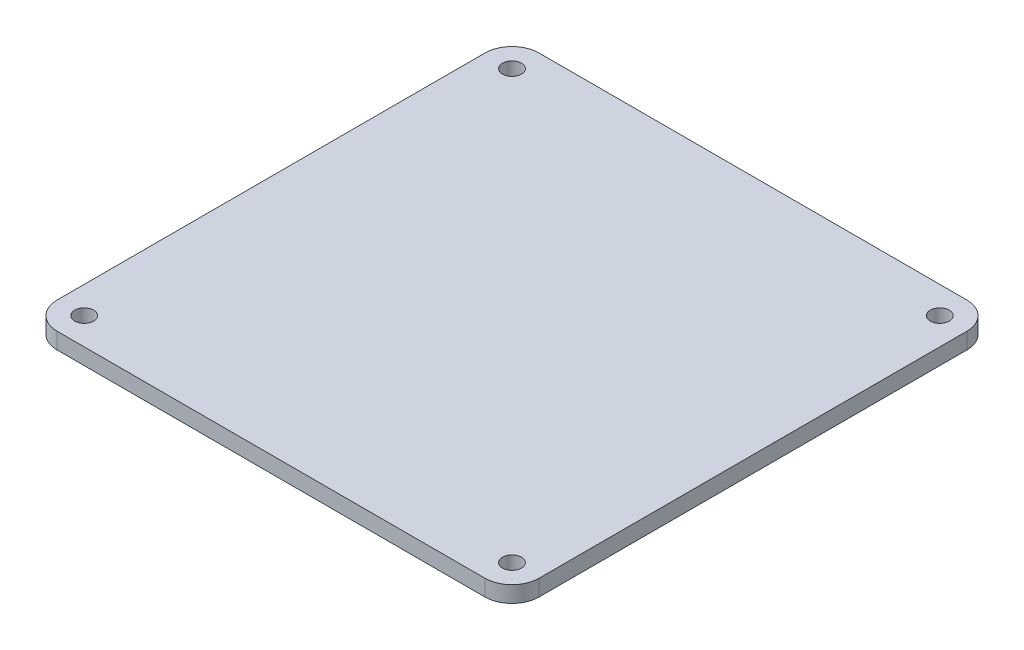
ISO-10303-21;
HEADER;
FILE_DESCRIPTION(('STEP AP214'),'2;1');
FILE_NAME('part.step','',(''),(''),'','','');
FILE_SCHEMA(('AUTOMOTIVE_DESIGN { 1 0 10303 214 1 1 1 1 }'));
ENDSEC;
DATA;
#1=APPLICATION_CONTEXT('core data for automotive mechanical design processes');
#2=APPLICATION_PROTOCOL_DEFINITION('international standard','automotive_design',2000,#1);
#3=PRODUCT_CONTEXT('',#1,'mechanical');
#4=PRODUCT('Part','Part','',(#3));
#5=PRODUCT_RELATED_PRODUCT_CATEGORY('part','',(#4));
#6=PRODUCT_DEFINITION_FORMATION('','',#4);
#7=PRODUCT_DEFINITION_CONTEXT('part definition',#1,'design');
#8=PRODUCT_DEFINITION('design','',#6,#7);
#9=PRODUCT_DEFINITION_SHAPE('','',#8);
#10=(LENGTH_UNIT() NAMED_UNIT(*) SI_UNIT(.MILLI.,.METRE.));
#11=(NAMED_UNIT(*) PLANE_ANGLE_UNIT() SI_UNIT($,.RADIAN.));
#12=(NAMED_UNIT(*) SI_UNIT($,.STERADIAN.) SOLID_ANGLE_UNIT());
#13=UNCERTAINTY_MEASURE_WITH_UNIT(LENGTH_MEASURE(1.E-05),#10,'distance_accuracy_value','');
#14=(GEOMETRIC_REPRESENTATION_CONTEXT(3) GLOBAL_UNCERTAINTY_ASSIGNED_CONTEXT((#13)) GLOBAL_UNIT_ASSIGNED_CONTEXT((#10,
#11,#12)) REPRESENTATION_CONTEXT('',''));
#15=CARTESIAN_POINT('',(0.,0.,0.));
#16=DIRECTION('',(0.,0.,1.));
#17=DIRECTION('',(1.,0.,0.));
#18=AXIS2_PLACEMENT_3D('',#15,#16,#17);
#19=CARTESIAN_POINT('',(-39.4940411236591,3.,-39.4940411236599));
#20=DIRECTION('',(0.,-1.,0.));
#21=DIRECTION('',(0.,0.,-1.));
#22=AXIS2_PLACEMENT_3D('',#19,#20,#21);
#23=CYLINDRICAL_SURFACE('',#22,5.);
#24=CARTESIAN_POINT('',(-39.4940411236591,0.,-39.4940411236599));
#25=DIRECTION('',(0.,1.,0.));
#26=DIRECTION('',(0.,0.,1.));
#27=AXIS2_PLACEMENT_3D('',#24,#25,#26);
#28=CIRCLE('',#27,5.);
#29=CARTESIAN_POINT('',(-44.4940411236591,0.,-39.4940411236599));
#30=VERTEX_POINT('',#29);
#31=CARTESIAN_POINT('',(-39.494041123659,0.,-44.4940411236599));
#32=VERTEX_POINT('',#31);
#33=EDGE_CURVE('E144',#30,#32,#28,.F.);
#34=ORIENTED_EDGE('',*,*,#33,.F.);
#35=DIRECTION('',(0.,-1.,0.));
#36=VECTOR('',#35,1.);
#37=CARTESIAN_POINT('',(-44.4940411236591,3.,-39.4940411236599));
#38=LINE('',#37,#36);
#39=CARTESIAN_POINT('',(-44.4940411236591,3.,-39.4940411236599));
#40=VERTEX_POINT('',#39);
#41=EDGE_CURVE('E11',#40,#30,#38,.T.);
#42=ORIENTED_EDGE('',*,*,#41,.F.);
#43=CARTESIAN_POINT('',(-39.4940411236591,3.,-39.4940411236599));
#44=DIRECTION('',(0.,1.,0.));
#45=DIRECTION('',(0.,0.,1.));
#46=AXIS2_PLACEMENT_3D('',#43,#44,#45);
#47=CIRCLE('',#46,5.);
#48=CARTESIAN_POINT('',(-39.494041123659,3.,-44.4940411236599));
#49=VERTEX_POINT('',#48);
#50=EDGE_CURVE('E180',#40,#49,#47,.F.);
#51=ORIENTED_EDGE('',*,*,#50,.T.);
#52=DIRECTION('',(0.,-1.,0.));
#53=VECTOR('',#52,1.);
#54=CARTESIAN_POINT('',(-39.494041123659,3.,-44.4940411236599));
#55=LINE('',#54,#53);
#56=EDGE_CURVE('E54',#49,#32,#55,.T.);
#57=ORIENTED_EDGE('',*,*,#56,.T.);
#58=EDGE_LOOP('',(#34,#42,#51,#57));
#59=FACE_BOUND('',#58,.T.);
#60=ADVANCED_FACE('F39',(#59),#23,.T.);
#61=CARTESIAN_POINT('',(-44.4940411236595,3.,-4.69042045730084E-13));
#62=DIRECTION('',(-1.,0.,0.));
#63=DIRECTION('',(0.,0.,1.));
#64=AXIS2_PLACEMENT_3D('',#61,#62,#63);
#65=PLANE('',#64);
#66=DIRECTION('',(0.,0.,-1.));
#67=VECTOR('',#66,1.);
#68=CARTESIAN_POINT('',(-44.4940411236595,0.,-4.69042045730084E-13));
#69=LINE('',#68,#67);
#70=CARTESIAN_POINT('',(-44.4940411236598,0.,39.4940411236592));
#71=VERTEX_POINT('',#70);
#72=EDGE_CURVE('E150',#71,#30,#69,.T.);
#73=ORIENTED_EDGE('',*,*,#72,.F.);
#74=DIRECTION('',(0.,-1.,0.));
#75=VECTOR('',#74,1.);
#76=CARTESIAN_POINT('',(-44.4940411236598,3.,39.4940411236592));
#77=LINE('',#76,#75);
#78=CARTESIAN_POINT('',(-44.4940411236598,3.,39.4940411236592));
#79=VERTEX_POINT('',#78);
#80=EDGE_CURVE('E50',#79,#71,#77,.T.);
#81=ORIENTED_EDGE('',*,*,#80,.F.);
#82=DIRECTION('',(0.,0.,-1.));
#83=VECTOR('',#82,1.);
#84=CARTESIAN_POINT('',(-44.4940411236595,3.,-4.69042045730084E-13));
#85=LINE('',#84,#83);
#86=EDGE_CURVE('E204',#79,#40,#85,.T.);
#87=ORIENTED_EDGE('',*,*,#86,.T.);
#88=ORIENTED_EDGE('',*,*,#41,.T.);
#89=EDGE_LOOP('',(#73,#81,#87,#88));
#90=FACE_BOUND('',#89,.T.);
#91=ADVANCED_FACE('F193',(#90),#65,.T.);
#92=CARTESIAN_POINT('',(-39.4940411236598,3.,39.4940411236592));
#93=DIRECTION('',(0.,-1.,0.));
#94=DIRECTION('',(0.,0.,-1.));
#95=AXIS2_PLACEMENT_3D('',#92,#93,#94);
#96=CYLINDRICAL_SURFACE('',#95,5.);
#97=CARTESIAN_POINT('',(-39.4940411236598,0.,39.4940411236592));
#98=DIRECTION('',(0.,1.,0.));
#99=DIRECTION('',(0.,0.,1.));
#100=AXIS2_PLACEMENT_3D('',#97,#98,#99);
#101=CIRCLE('',#100,5.);
#102=CARTESIAN_POINT('',(-39.4940411236598,0.,44.4940411236592));
#103=VERTEX_POINT('',#102);
#104=EDGE_CURVE('E147',#103,#71,#101,.F.);
#105=ORIENTED_EDGE('',*,*,#104,.F.);
#106=DIRECTION('',(0.,-1.,0.));
#107=VECTOR('',#106,1.);
#108=CARTESIAN_POINT('',(-39.4940411236598,3.,44.4940411236592));
#109=LINE('',#108,#107);
#110=CARTESIAN_POINT('',(-39.4940411236598,3.,44.4940411236592));
#111=VERTEX_POINT('',#110);
#112=EDGE_CURVE('E181',#111,#103,#109,.T.);
#113=ORIENTED_EDGE('',*,*,#112,.F.);
#114=CARTESIAN_POINT('',(-39.4940411236598,3.,39.4940411236592));
#115=DIRECTION('',(0.,1.,0.));
#116=DIRECTION('',(0.,0.,1.));
#117=AXIS2_PLACEMENT_3D('',#114,#115,#116);
#118=CIRCLE('',#117,5.);
#119=EDGE_CURVE('E188',#111,#79,#118,.F.);
#120=ORIENTED_EDGE('',*,*,#119,.T.);
#121=ORIENTED_EDGE('',*,*,#80,.T.);
#122=EDGE_LOOP('',(#105,#113,#120,#121));
#123=FACE_BOUND('',#122,.T.);
#124=ADVANCED_FACE('F189',(#123),#96,.T.);
#125=CARTESIAN_POINT('',(-3.1269469715339E-13,3.,44.4940411236595));
#126=DIRECTION('',(0.,0.,1.));
#127=DIRECTION('',(1.,0.,0.));
#128=AXIS2_PLACEMENT_3D('',#125,#126,#127);
#129=PLANE('',#128);
#130=DIRECTION('',(-1.,0.,0.));
#131=VECTOR('',#130,1.);
#132=CARTESIAN_POINT('',(-3.1269469715339E-13,0.,44.4940411236595));
#133=LINE('',#132,#131);
#134=CARTESIAN_POINT('',(39.4940411236593,0.,44.4940411236596));
#135=VERTEX_POINT('',#134);
#136=EDGE_CURVE('E153',#135,#103,#133,.T.);
#137=ORIENTED_EDGE('',*,*,#136,.F.);
#138=DIRECTION('',(0.,-1.,0.));
#139=VECTOR('',#138,1.);
#140=CARTESIAN_POINT('',(39.4940411236593,3.,44.4940411236596));
#141=LINE('',#140,#139);
#142=CARTESIAN_POINT('',(39.4940411236593,3.,44.4940411236596));
#143=VERTEX_POINT('',#142);
#144=EDGE_CURVE('E182',#143,#135,#141,.T.);
#145=ORIENTED_EDGE('',*,*,#144,.F.);
#146=DIRECTION('',(-1.,0.,0.));
#147=VECTOR('',#146,1.);
#148=CARTESIAN_POINT('',(-3.1269469715339E-13,3.,44.4940411236595));
#149=LINE('',#148,#147);
#150=EDGE_CURVE('E201',#143,#111,#149,.T.);
#151=ORIENTED_EDGE('',*,*,#150,.T.);
#152=ORIENTED_EDGE('',*,*,#112,.T.);
#153=EDGE_LOOP('',(#137,#145,#151,#152));
#154=FACE_BOUND('',#153,.T.);
#155=ADVANCED_FACE('F203',(#154),#129,.T.);
#156=CARTESIAN_POINT('',(39.4940411236594,3.,39.4940411236596));
#157=DIRECTION('',(0.,-1.,0.));
#158=DIRECTION('',(0.,0.,-1.));
#159=AXIS2_PLACEMENT_3D('',#156,#157,#158);
#160=CYLINDRICAL_SURFACE('',#159,5.);
#161=CARTESIAN_POINT('',(39.4940411236594,0.,39.4940411236596));
#162=DIRECTION('',(0.,1.,0.));
#163=DIRECTION('',(0.,0.,1.));
#164=AXIS2_PLACEMENT_3D('',#161,#162,#163);
#165=CIRCLE('',#164,5.);
#166=CARTESIAN_POINT('',(44.4940411236594,0.,39.4940411236596));
#167=VERTEX_POINT('',#166);
#168=EDGE_CURVE('E156',#167,#135,#165,.F.);
#169=ORIENTED_EDGE('',*,*,#168,.F.);
#170=DIRECTION('',(0.,-1.,0.));
#171=VECTOR('',#170,1.);
#172=CARTESIAN_POINT('',(44.4940411236594,3.,39.4940411236596));
#173=LINE('',#172,#171);
#174=CARTESIAN_POINT('',(44.4940411236594,3.,39.4940411236596));
#175=VERTEX_POINT('',#174);
#176=EDGE_CURVE('E111',#175,#167,#173,.T.);
#177=ORIENTED_EDGE('',*,*,#176,.F.);
#178=CARTESIAN_POINT('',(39.4940411236594,3.,39.4940411236596));
#179=DIRECTION('',(0.,1.,0.));
#180=DIRECTION('',(0.,0.,1.));
#181=AXIS2_PLACEMENT_3D('',#178,#179,#180);
#182=CIRCLE('',#181,5.);
#183=EDGE_CURVE('E124',#175,#143,#182,.F.);
#184=ORIENTED_EDGE('',*,*,#183,.T.);
#185=ORIENTED_EDGE('',*,*,#144,.T.);
#186=EDGE_LOOP('',(#169,#177,#184,#185));
#187=FACE_BOUND('',#186,.T.);
#188=ADVANCED_FACE('F209',(#187),#160,.T.);
#189=CARTESIAN_POINT('',(44.4940411236595,3.,1.56347348576696E-13));
#190=DIRECTION('',(1.,0.,0.));
#191=DIRECTION('',(0.,0.,-1.));
#192=AXIS2_PLACEMENT_3D('',#189,#190,#191);
#193=PLANE('',#192);
#194=DIRECTION('',(0.,0.,1.));
#195=VECTOR('',#194,1.);
#196=CARTESIAN_POINT('',(44.4940411236595,0.,1.56347348576696E-13));
#197=LINE('',#196,#195);
#198=CARTESIAN_POINT('',(44.4940411236595,0.,-39.4940411236595));
#199=VERTEX_POINT('',#198);
#200=EDGE_CURVE('E109',#199,#167,#197,.T.);
#201=ORIENTED_EDGE('',*,*,#200,.F.);
#202=DIRECTION('',(0.,-1.,0.));
#203=VECTOR('',#202,1.);
#204=CARTESIAN_POINT('',(44.4940411236595,3.,-39.4940411236595));
#205=LINE('',#204,#203);
#206=CARTESIAN_POINT('',(44.4940411236595,3.,-39.4940411236595));
#207=VERTEX_POINT('',#206);
#208=EDGE_CURVE('E104',#207,#199,#205,.T.);
#209=ORIENTED_EDGE('',*,*,#208,.F.);
#210=DIRECTION('',(0.,0.,1.));
#211=VECTOR('',#210,1.);
#212=CARTESIAN_POINT('',(44.4940411236595,3.,1.56347348576696E-13));
#213=LINE('',#212,#211);
#214=EDGE_CURVE('E107',#207,#175,#213,.T.);
#215=ORIENTED_EDGE('',*,*,#214,.T.);
#216=ORIENTED_EDGE('',*,*,#176,.T.);
#217=EDGE_LOOP('',(#201,#209,#215,#216));
#218=FACE_BOUND('',#217,.T.);
#219=ADVANCED_FACE('F110',(#218),#193,.T.);
#220=CARTESIAN_POINT('',(39.4940411236595,3.,-39.4940411236595));
#221=DIRECTION('',(0.,-1.,0.));
#222=DIRECTION('',(0.,0.,-1.));
#223=AXIS2_PLACEMENT_3D('',#220,#221,#222);
#224=CYLINDRICAL_SURFACE('',#223,5.);
#225=CARTESIAN_POINT('',(39.4940411236595,0.,-39.4940411236595));
#226=DIRECTION('',(0.,1.,0.));
#227=DIRECTION('',(0.,0.,1.));
#228=AXIS2_PLACEMENT_3D('',#225,#226,#227);
#229=CIRCLE('',#228,5.);
#230=CARTESIAN_POINT('',(39.4940411236595,0.,-44.4940411236595));
#231=VERTEX_POINT('',#230);
#232=EDGE_CURVE('E159',#231,#199,#229,.F.);
#233=ORIENTED_EDGE('',*,*,#232,.F.);
#234=DIRECTION('',(0.,-1.,0.));
#235=VECTOR('',#234,1.);
#236=CARTESIAN_POINT('',(39.4940411236595,3.,-44.4940411236595));
#237=LINE('',#236,#235);
#238=CARTESIAN_POINT('',(39.4940411236595,3.,-44.4940411236595));
#239=VERTEX_POINT('',#238);
#240=EDGE_CURVE('E78',#239,#231,#237,.T.);
#241=ORIENTED_EDGE('',*,*,#240,.F.);
#242=CARTESIAN_POINT('',(39.4940411236595,3.,-39.4940411236595));
#243=DIRECTION('',(0.,1.,0.));
#244=DIRECTION('',(0.,0.,1.));
#245=AXIS2_PLACEMENT_3D('',#242,#243,#244);
#246=CIRCLE('',#245,5.);
#247=EDGE_CURVE('E125',#239,#207,#246,.F.);
#248=ORIENTED_EDGE('',*,*,#247,.T.);
#249=ORIENTED_EDGE('',*,*,#208,.T.);
#250=EDGE_LOOP('',(#233,#241,#248,#249));
#251=FACE_BOUND('',#250,.T.);
#252=ADVANCED_FACE('F130',(#251),#224,.T.);
#253=CARTESIAN_POINT('',(39.4940411236595,3.,-39.4940411236595));
#254=DIRECTION('',(0.,-1.,0.));
#255=DIRECTION('',(0.,0.,-1.));
#256=AXIS2_PLACEMENT_3D('',#253,#254,#255);
#257=CYLINDRICAL_SURFACE('',#256,1.75);
#258=CARTESIAN_POINT('',(39.4940411236595,3.,-39.4940411236595));
#259=DIRECTION('',(0.,1.,0.));
#260=DIRECTION('',(0.,0.,1.));
#261=AXIS2_PLACEMENT_3D('',#258,#259,#260);
#262=CIRCLE('',#261,1.75);
#263=CARTESIAN_POINT('',(39.4940411236595,3.,-37.7440411236595));
#264=VERTEX_POINT('',#263);
#265=EDGE_CURVE('E138',#264,#264,#262,.T.);
#266=ORIENTED_EDGE('',*,*,#265,.T.);
#267=EDGE_LOOP('',(#266));
#268=FACE_BOUND('',#267,.T.);
#269=CARTESIAN_POINT('',(39.4940411236595,0.,-39.4940411236595));
#270=DIRECTION('',(0.,1.,0.));
#271=DIRECTION('',(0.,0.,1.));
#272=AXIS2_PLACEMENT_3D('',#269,#270,#271);
#273=CIRCLE('',#272,1.75);
#274=CARTESIAN_POINT('',(39.4940411236595,0.,-37.7440411236595));
#275=VERTEX_POINT('',#274);
#276=EDGE_CURVE('E172',#275,#275,#273,.T.);
#277=ORIENTED_EDGE('',*,*,#276,.F.);
#278=EDGE_LOOP('',(#277));
#279=FACE_BOUND('',#278,.T.);
#280=ADVANCED_FACE('F242',(#268,#279),#257,.F.);
#281=CARTESIAN_POINT('',(-39.4940411236595,3.,-39.4940411236595));
#282=DIRECTION('',(0.,-1.,0.));
#283=DIRECTION('',(0.,0.,-1.));
#284=AXIS2_PLACEMENT_3D('',#281,#282,#283);
#285=CYLINDRICAL_SURFACE('',#284,1.75);
#286=CARTESIAN_POINT('',(-39.4940411236595,3.,-39.4940411236595));
#287=DIRECTION('',(0.,1.,0.));
#288=DIRECTION('',(0.,0.,1.));
#289=AXIS2_PLACEMENT_3D('',#286,#287,#288);
#290=CIRCLE('',#289,1.75);
#291=CARTESIAN_POINT('',(-39.4940411236595,3.,-37.7440411236595));
#292=VERTEX_POINT('',#291);
#293=EDGE_CURVE('E136',#292,#292,#290,.F.);
#294=ORIENTED_EDGE('',*,*,#293,.F.);
#295=EDGE_LOOP('',(#294));
#296=FACE_BOUND('',#295,.T.);
#297=CARTESIAN_POINT('',(-39.4940411236595,0.,-39.4940411236595));
#298=DIRECTION('',(0.,1.,0.));
#299=DIRECTION('',(0.,0.,1.));
#300=AXIS2_PLACEMENT_3D('',#297,#298,#299);
#301=CIRCLE('',#300,1.75);
#302=CARTESIAN_POINT('',(-39.4940411236595,0.,-37.7440411236595));
#303=VERTEX_POINT('',#302);
#304=EDGE_CURVE('E169',#303,#303,#301,.F.);
#305=ORIENTED_EDGE('',*,*,#304,.T.);
#306=EDGE_LOOP('',(#305));
#307=FACE_BOUND('',#306,.T.);
#308=ADVANCED_FACE('F225',(#296,#307),#285,.F.);
#309=CARTESIAN_POINT('',(-39.4940411236595,3.,39.4940411236595));
#310=DIRECTION('',(0.,-1.,0.));
#311=DIRECTION('',(0.,0.,-1.));
#312=AXIS2_PLACEMENT_3D('',#309,#310,#311);
#313=CYLINDRICAL_SURFACE('',#312,1.75);
#314=CARTESIAN_POINT('',(-39.4940411236595,3.,39.4940411236595));
#315=DIRECTION('',(0.,1.,0.));
#316=DIRECTION('',(0.,0.,1.));
#317=AXIS2_PLACEMENT_3D('',#314,#315,#316);
#318=CIRCLE('',#317,1.75);
#319=CARTESIAN_POINT('',(-39.4940411236595,3.,41.2440411236595));
#320=VERTEX_POINT('',#319);
#321=EDGE_CURVE('E128',#320,#320,#318,.T.);
#322=ORIENTED_EDGE('',*,*,#321,.T.);
#323=EDGE_LOOP('',(#322));
#324=FACE_BOUND('',#323,.T.);
#325=CARTESIAN_POINT('',(-39.4940411236595,0.,39.4940411236595));
#326=DIRECTION('',(0.,1.,0.));
#327=DIRECTION('',(0.,0.,1.));
#328=AXIS2_PLACEMENT_3D('',#325,#326,#327);
#329=CIRCLE('',#328,1.75);
#330=CARTESIAN_POINT('',(-39.4940411236595,0.,41.2440411236595));
#331=VERTEX_POINT('',#330);
#332=EDGE_CURVE('E164',#331,#331,#329,.T.);
#333=ORIENTED_EDGE('',*,*,#332,.F.);
#334=EDGE_LOOP('',(#333));
#335=FACE_BOUND('',#334,.T.);
#336=ADVANCED_FACE('F212',(#324,#335),#313,.F.);
#337=CARTESIAN_POINT('',(0.,3.,-44.4940411236595));
#338=DIRECTION('',(0.,0.,-1.));
#339=DIRECTION('',(-1.,0.,0.));
#340=AXIS2_PLACEMENT_3D('',#337,#338,#339);
#341=PLANE('',#340);
#342=DIRECTION('',(1.,0.,0.));
#343=VECTOR('',#342,1.);
#344=CARTESIAN_POINT('',(0.,0.,-44.4940411236595));
#345=LINE('',#344,#343);
#346=EDGE_CURVE('E165',#32,#231,#345,.T.);
#347=ORIENTED_EDGE('',*,*,#346,.F.);
#348=ORIENTED_EDGE('',*,*,#56,.F.);
#349=DIRECTION('',(1.,0.,0.));
#350=VECTOR('',#349,1.);
#351=CARTESIAN_POINT('',(0.,3.,-44.4940411236595));
#352=LINE('',#351,#350);
#353=EDGE_CURVE('E126',#49,#239,#352,.T.);
#354=ORIENTED_EDGE('',*,*,#353,.T.);
#355=ORIENTED_EDGE('',*,*,#240,.T.);
#356=EDGE_LOOP('',(#347,#348,#354,#355));
#357=FACE_BOUND('',#356,.T.);
#358=ADVANCED_FACE('F211',(#357),#341,.T.);
#359=CARTESIAN_POINT('',(39.4940411236595,3.,39.4940411236595));
#360=DIRECTION('',(0.,-1.,0.));
#361=DIRECTION('',(0.,0.,-1.));
#362=AXIS2_PLACEMENT_3D('',#359,#360,#361);
#363=CYLINDRICAL_SURFACE('',#362,1.75);
#364=CARTESIAN_POINT('',(39.4940411236595,3.,39.4940411236595));
#365=DIRECTION('',(0.,1.,0.));
#366=DIRECTION('',(0.,0.,1.));
#367=AXIS2_PLACEMENT_3D('',#364,#365,#366);
#368=CIRCLE('',#367,1.75);
#369=CARTESIAN_POINT('',(39.4940411236595,3.,41.2440411236595));
#370=VERTEX_POINT('',#369);
#371=EDGE_CURVE('E142',#370,#370,#368,.F.);
#372=ORIENTED_EDGE('',*,*,#371,.F.);
#373=EDGE_LOOP('',(#372));
#374=FACE_BOUND('',#373,.T.);
#375=CARTESIAN_POINT('',(39.4940411236595,0.,39.4940411236595));
#376=DIRECTION('',(0.,1.,0.));
#377=DIRECTION('',(0.,0.,1.));
#378=AXIS2_PLACEMENT_3D('',#375,#376,#377);
#379=CIRCLE('',#378,1.75);
#380=CARTESIAN_POINT('',(39.4940411236595,0.,41.2440411236595));
#381=VERTEX_POINT('',#380);
#382=EDGE_CURVE('E171',#381,#381,#379,.F.);
#383=ORIENTED_EDGE('',*,*,#382,.T.);
#384=EDGE_LOOP('',(#383));
#385=FACE_BOUND('',#384,.T.);
#386=ADVANCED_FACE('F213',(#374,#385),#363,.F.);
#387=CARTESIAN_POINT('',(0.,3.,0.));
#388=DIRECTION('',(0.,1.,0.));
#389=DIRECTION('',(0.,0.,1.));
#390=AXIS2_PLACEMENT_3D('',#387,#388,#389);
#391=PLANE('',#390);
#392=ORIENTED_EDGE('',*,*,#50,.F.);
#393=ORIENTED_EDGE('',*,*,#86,.F.);
#394=ORIENTED_EDGE('',*,*,#119,.F.);
#395=ORIENTED_EDGE('',*,*,#150,.F.);
#396=ORIENTED_EDGE('',*,*,#183,.F.);
#397=ORIENTED_EDGE('',*,*,#214,.F.);
#398=ORIENTED_EDGE('',*,*,#247,.F.);
#399=ORIENTED_EDGE('',*,*,#353,.F.);
#400=EDGE_LOOP('',(#392,#393,#394,#395,#396,#397,#398,#399));
#401=FACE_BOUND('',#400,.T.);
#402=ORIENTED_EDGE('',*,*,#321,.F.);
#403=EDGE_LOOP('',(#402));
#404=FACE_BOUND('',#403,.T.);
#405=ORIENTED_EDGE('',*,*,#293,.T.);
#406=EDGE_LOOP('',(#405));
#407=FACE_BOUND('',#406,.T.);
#408=ORIENTED_EDGE('',*,*,#265,.F.);
#409=EDGE_LOOP('',(#408));
#410=FACE_BOUND('',#409,.T.);
#411=ORIENTED_EDGE('',*,*,#371,.T.);
#412=EDGE_LOOP('',(#411));
#413=FACE_BOUND('',#412,.T.);
#414=ADVANCED_FACE('F116',(#401,#404,#407,#410,#413),#391,.T.);
#415=CARTESIAN_POINT('',(0.,0.,0.));
#416=DIRECTION('',(0.,1.,0.));
#417=DIRECTION('',(0.,0.,1.));
#418=AXIS2_PLACEMENT_3D('',#415,#416,#417);
#419=PLANE('',#418);
#420=ORIENTED_EDGE('',*,*,#33,.T.);
#421=ORIENTED_EDGE('',*,*,#346,.T.);
#422=ORIENTED_EDGE('',*,*,#232,.T.);
#423=ORIENTED_EDGE('',*,*,#200,.T.);
#424=ORIENTED_EDGE('',*,*,#168,.T.);
#425=ORIENTED_EDGE('',*,*,#136,.T.);
#426=ORIENTED_EDGE('',*,*,#104,.T.);
#427=ORIENTED_EDGE('',*,*,#72,.T.);
#428=EDGE_LOOP('',(#420,#421,#422,#423,#424,#425,#426,#427));
#429=FACE_BOUND('',#428,.T.);
#430=ORIENTED_EDGE('',*,*,#332,.T.);
#431=EDGE_LOOP('',(#430));
#432=FACE_BOUND('',#431,.T.);
#433=ORIENTED_EDGE('',*,*,#304,.F.);
#434=EDGE_LOOP('',(#433));
#435=FACE_BOUND('',#434,.T.);
#436=ORIENTED_EDGE('',*,*,#276,.T.);
#437=EDGE_LOOP('',(#436));
#438=FACE_BOUND('',#437,.T.);
#439=ORIENTED_EDGE('',*,*,#382,.F.);
#440=EDGE_LOOP('',(#439));
#441=FACE_BOUND('',#440,.T.);
#442=ADVANCED_FACE('F198',(#429,#432,#435,#438,#441),#419,.F.);
#443=CLOSED_SHELL('',(#60,#91,#124,#155,#188,#219,#252,#280,#308,#336,#358,#386,#414,#442));
#444=MANIFOLD_SOLID_BREP('B2',#443);
#445=ADVANCED_BREP_SHAPE_REPRESENTATION('',(#18,#444),#14);
#446=SHAPE_DEFINITION_REPRESENTATION(#9,#445);
ENDSEC;
END-ISO-10303-21;
